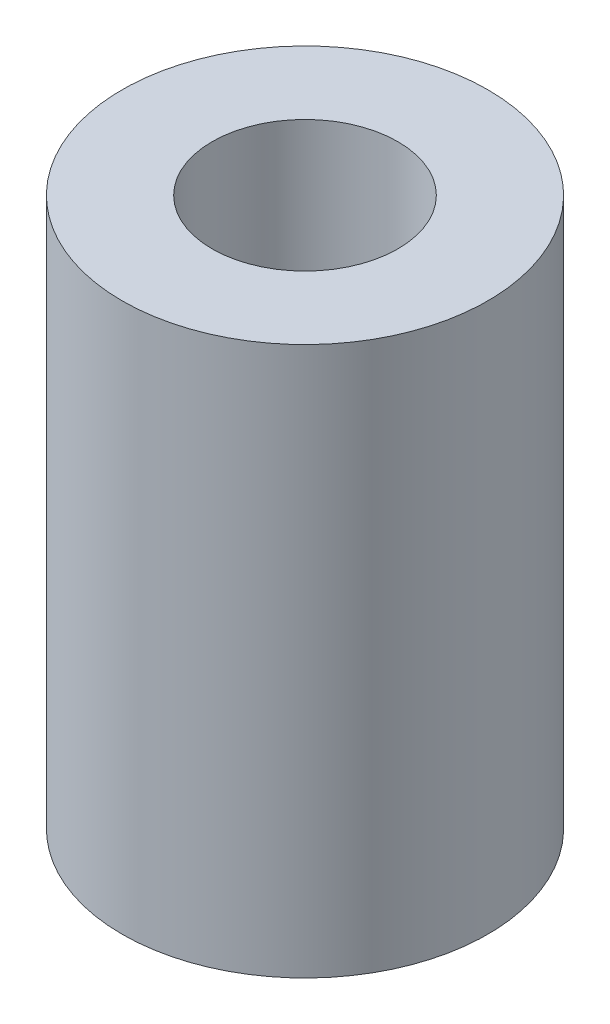
ISO-10303-21;
HEADER;
FILE_DESCRIPTION(('STEP AP214'),'2;1');
FILE_NAME('part.step','',(''),(''),'','','');
FILE_SCHEMA(('AUTOMOTIVE_DESIGN { 1 0 10303 214 1 1 1 1 }'));
ENDSEC;
DATA;
#1=APPLICATION_CONTEXT('core data for automotive mechanical design processes');
#2=APPLICATION_PROTOCOL_DEFINITION('international standard','automotive_design',2000,#1);
#3=PRODUCT_CONTEXT('',#1,'mechanical');
#4=PRODUCT('Part','Part','',(#3));
#5=PRODUCT_RELATED_PRODUCT_CATEGORY('part','',(#4));
#6=PRODUCT_DEFINITION_FORMATION('','',#4);
#7=PRODUCT_DEFINITION_CONTEXT('part definition',#1,'design');
#8=PRODUCT_DEFINITION('design','',#6,#7);
#9=PRODUCT_DEFINITION_SHAPE('','',#8);
#10=(LENGTH_UNIT() NAMED_UNIT(*) SI_UNIT(.MILLI.,.METRE.));
#11=(NAMED_UNIT(*) PLANE_ANGLE_UNIT() SI_UNIT($,.RADIAN.));
#12=(NAMED_UNIT(*) SI_UNIT($,.STERADIAN.) SOLID_ANGLE_UNIT());
#13=UNCERTAINTY_MEASURE_WITH_UNIT(LENGTH_MEASURE(1.E-05),#10,'distance_accuracy_value','');
#14=(GEOMETRIC_REPRESENTATION_CONTEXT(3) GLOBAL_UNCERTAINTY_ASSIGNED_CONTEXT((#13)) GLOBAL_UNIT_ASSIGNED_CONTEXT((#10,
#11,#12)) REPRESENTATION_CONTEXT('',''));
#15=CARTESIAN_POINT('',(0.,0.,0.));
#16=DIRECTION('',(0.,0.,1.));
#17=DIRECTION('',(1.,0.,0.));
#18=AXIS2_PLACEMENT_3D('',#15,#16,#17);
#19=CARTESIAN_POINT('',(0.,15.,0.));
#20=DIRECTION('',(0.,1.,0.));
#21=DIRECTION('',(0.,0.,1.));
#22=AXIS2_PLACEMENT_3D('',#19,#20,#21);
#23=PLANE('',#22);
#24=CARTESIAN_POINT('',(0.,15.,0.));
#25=DIRECTION('',(0.,1.,0.));
#26=DIRECTION('',(0.,0.,1.));
#27=AXIS2_PLACEMENT_3D('',#24,#25,#26);
#28=CIRCLE('',#27,5.);
#29=CARTESIAN_POINT('',(0.,15.,5.));
#30=VERTEX_POINT('',#29);
#31=EDGE_CURVE('E10',#30,#30,#28,.T.);
#32=ORIENTED_EDGE('',*,*,#31,.T.);
#33=EDGE_LOOP('',(#32));
#34=FACE_BOUND('',#33,.T.);
#35=CARTESIAN_POINT('',(0.,15.,0.));
#36=DIRECTION('',(0.,1.,0.));
#37=DIRECTION('',(0.,0.,1.));
#38=AXIS2_PLACEMENT_3D('',#35,#36,#37);
#39=CIRCLE('',#38,2.54);
#40=CARTESIAN_POINT('',(0.,15.,2.54));
#41=VERTEX_POINT('',#40);
#42=EDGE_CURVE('E44',#41,#41,#39,.T.);
#43=ORIENTED_EDGE('',*,*,#42,.F.);
#44=EDGE_LOOP('',(#43));
#45=FACE_BOUND('',#44,.T.);
#46=ADVANCED_FACE('F33',(#34,#45),#23,.T.);
#47=CARTESIAN_POINT('',(0.,0.,0.));
#48=DIRECTION('',(0.,1.,0.));
#49=DIRECTION('',(0.,0.,1.));
#50=AXIS2_PLACEMENT_3D('',#47,#48,#49);
#51=PLANE('',#50);
#52=CARTESIAN_POINT('',(0.,0.,0.));
#53=DIRECTION('',(0.,1.,0.));
#54=DIRECTION('',(0.,0.,1.));
#55=AXIS2_PLACEMENT_3D('',#52,#53,#54);
#56=CIRCLE('',#55,5.);
#57=CARTESIAN_POINT('',(0.,0.,5.));
#58=VERTEX_POINT('',#57);
#59=EDGE_CURVE('E37',#58,#58,#56,.T.);
#60=ORIENTED_EDGE('',*,*,#59,.F.);
#61=EDGE_LOOP('',(#60));
#62=FACE_BOUND('',#61,.T.);
#63=CARTESIAN_POINT('',(0.,0.,0.));
#64=DIRECTION('',(0.,1.,0.));
#65=DIRECTION('',(0.,0.,1.));
#66=AXIS2_PLACEMENT_3D('',#63,#64,#65);
#67=CIRCLE('',#66,2.54);
#68=CARTESIAN_POINT('',(0.,0.,2.54));
#69=VERTEX_POINT('',#68);
#70=EDGE_CURVE('E46',#69,#69,#67,.T.);
#71=ORIENTED_EDGE('',*,*,#70,.T.);
#72=EDGE_LOOP('',(#71));
#73=FACE_BOUND('',#72,.T.);
#74=ADVANCED_FACE('F56',(#62,#73),#51,.F.);
#75=CARTESIAN_POINT('',(0.,15.,0.));
#76=DIRECTION('',(0.,-1.,0.));
#77=DIRECTION('',(0.,0.,-1.));
#78=AXIS2_PLACEMENT_3D('',#75,#76,#77);
#79=CYLINDRICAL_SURFACE('',#78,5.);
#80=ORIENTED_EDGE('',*,*,#31,.F.);
#81=EDGE_LOOP('',(#80));
#82=FACE_BOUND('',#81,.T.);
#83=ORIENTED_EDGE('',*,*,#59,.T.);
#84=EDGE_LOOP('',(#83));
#85=FACE_BOUND('',#84,.T.);
#86=ADVANCED_FACE('F35',(#82,#85),#79,.T.);
#87=CARTESIAN_POINT('',(0.,15.,0.));
#88=DIRECTION('',(0.,-1.,0.));
#89=DIRECTION('',(0.,0.,-1.));
#90=AXIS2_PLACEMENT_3D('',#87,#88,#89);
#91=CYLINDRICAL_SURFACE('',#90,2.54);
#92=ORIENTED_EDGE('',*,*,#42,.T.);
#93=EDGE_LOOP('',(#92));
#94=FACE_BOUND('',#93,.T.);
#95=ORIENTED_EDGE('',*,*,#70,.F.);
#96=EDGE_LOOP('',(#95));
#97=FACE_BOUND('',#96,.T.);
#98=ADVANCED_FACE('F52',(#94,#97),#91,.F.);
#99=CLOSED_SHELL('',(#46,#74,#86,#98));
#100=MANIFOLD_SOLID_BREP('B2',#99);
#101=ADVANCED_BREP_SHAPE_REPRESENTATION('',(#18,#100),#14);
#102=SHAPE_DEFINITION_REPRESENTATION(#9,#101);
ENDSEC;
END-ISO-10303-21;
